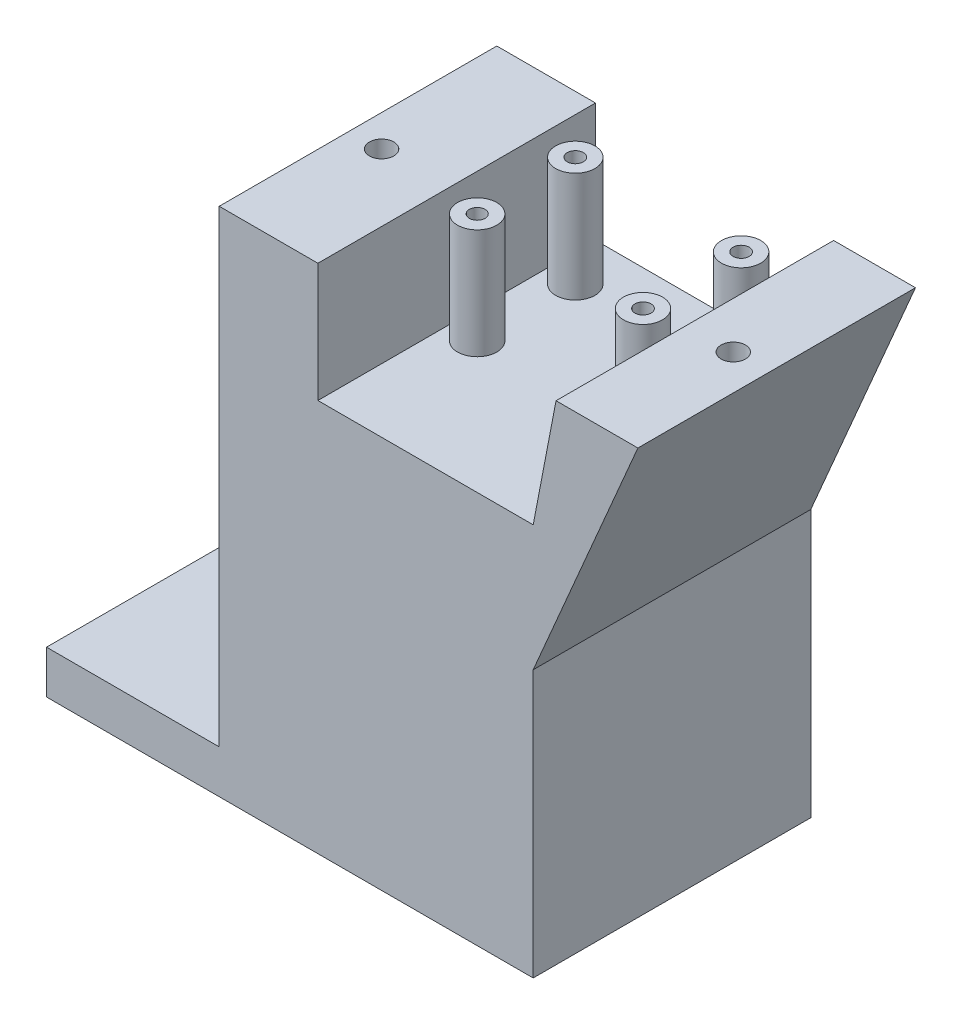
ISO-10303-21;
HEADER;
FILE_DESCRIPTION(('STEP AP214'),'2;1');
FILE_NAME('part.step','',(''),(''),'','','');
FILE_SCHEMA(('AUTOMOTIVE_DESIGN { 1 0 10303 214 1 1 1 1 }'));
ENDSEC;
DATA;
#1=APPLICATION_CONTEXT('core data for automotive mechanical design processes');
#2=APPLICATION_PROTOCOL_DEFINITION('international standard','automotive_design',2000,#1);
#3=PRODUCT_CONTEXT('',#1,'mechanical');
#4=PRODUCT('Part','Part','',(#3));
#5=PRODUCT_RELATED_PRODUCT_CATEGORY('part','',(#4));
#6=PRODUCT_DEFINITION_FORMATION('','',#4);
#7=PRODUCT_DEFINITION_CONTEXT('part definition',#1,'design');
#8=PRODUCT_DEFINITION('design','',#6,#7);
#9=PRODUCT_DEFINITION_SHAPE('','',#8);
#10=(LENGTH_UNIT() NAMED_UNIT(*) SI_UNIT(.MILLI.,.METRE.));
#11=(NAMED_UNIT(*) PLANE_ANGLE_UNIT() SI_UNIT($,.RADIAN.));
#12=(NAMED_UNIT(*) SI_UNIT($,.STERADIAN.) SOLID_ANGLE_UNIT());
#13=UNCERTAINTY_MEASURE_WITH_UNIT(LENGTH_MEASURE(1.E-05),#10,'distance_accuracy_value','');
#14=(GEOMETRIC_REPRESENTATION_CONTEXT(3) GLOBAL_UNCERTAINTY_ASSIGNED_CONTEXT((#13)) GLOBAL_UNIT_ASSIGNED_CONTEXT((#10,
#11,#12)) REPRESENTATION_CONTEXT('',''));
#15=CARTESIAN_POINT('',(0.,0.,0.));
#16=DIRECTION('',(0.,0.,1.));
#17=DIRECTION('',(1.,0.,0.));
#18=AXIS2_PLACEMENT_3D('',#15,#16,#17);
#19=CARTESIAN_POINT('',(0.,50.,0.));
#20=DIRECTION('',(0.,-1.,0.));
#21=DIRECTION('',(0.,0.,-1.));
#22=AXIS2_PLACEMENT_3D('',#19,#20,#21);
#23=PLANE('',#22);
#24=CARTESIAN_POINT('',(3.35567931406741,50.,3.88923337716912));
#25=DIRECTION('',(0.,-1.,0.));
#26=DIRECTION('',(0.,0.,-1.));
#27=AXIS2_PLACEMENT_3D('',#24,#25,#26);
#28=CIRCLE('',#27,2.5);
#29=CARTESIAN_POINT('',(3.35567931406741,50.,1.38923337716912));
#30=VERTEX_POINT('',#29);
#31=EDGE_CURVE('E349',#30,#30,#28,.F.);
#32=ORIENTED_EDGE('',*,*,#31,.F.);
#33=EDGE_LOOP('',(#32));
#34=FACE_BOUND('',#33,.T.);
#35=CARTESIAN_POINT('',(24.3556793140674,50.,3.76423337163295));
#36=DIRECTION('',(0.,-1.,0.));
#37=DIRECTION('',(0.,0.,-1.));
#38=AXIS2_PLACEMENT_3D('',#35,#36,#37);
#39=CIRCLE('',#38,2.5);
#40=CARTESIAN_POINT('',(24.3556793140674,50.,1.26423337163295));
#41=VERTEX_POINT('',#40);
#42=EDGE_CURVE('E353',#41,#41,#39,.F.);
#43=ORIENTED_EDGE('',*,*,#42,.F.);
#44=EDGE_LOOP('',(#43));
#45=FACE_BOUND('',#44,.T.);
#46=CARTESIAN_POINT('',(3.35567931406741,50.,-8.61076662283088));
#47=DIRECTION('',(0.,-1.,0.));
#48=DIRECTION('',(0.,0.,-1.));
#49=AXIS2_PLACEMENT_3D('',#46,#47,#48);
#50=CIRCLE('',#49,2.5);
#51=CARTESIAN_POINT('',(3.35567931406741,50.,-11.1107666228309));
#52=VERTEX_POINT('',#51);
#53=EDGE_CURVE('E55',#52,#52,#50,.F.);
#54=ORIENTED_EDGE('',*,*,#53,.F.);
#55=EDGE_LOOP('',(#54));
#56=FACE_BOUND('',#55,.T.);
#57=CARTESIAN_POINT('',(24.3553072869625,50.,-8.73576662283088));
#58=DIRECTION('',(0.,-1.,0.));
#59=DIRECTION('',(0.,0.,-1.));
#60=AXIS2_PLACEMENT_3D('',#57,#58,#59);
#61=CIRCLE('',#60,2.5);
#62=CARTESIAN_POINT('',(24.3553072869625,50.,-11.2357666228309));
#63=VERTEX_POINT('',#62);
#64=EDGE_CURVE('E11',#63,#63,#61,.F.);
#65=ORIENTED_EDGE('',*,*,#64,.F.);
#66=EDGE_LOOP('',(#65));
#67=FACE_BOUND('',#66,.T.);
#68=DIRECTION('',(0.,0.,-1.));
#69=VECTOR('',#68,1.);
#70=CARTESIAN_POINT('',(-0.197301823022314,50.,20.6271973839208));
#71=LINE('',#70,#69);
#72=CARTESIAN_POINT('',(-0.197301823022314,50.,20.6271973839208));
#73=VERTEX_POINT('',#72);
#74=CARTESIAN_POINT('',(-0.197301823022314,50.,-14.7357666228309));
#75=VERTEX_POINT('',#74);
#76=EDGE_CURVE('E67',#73,#75,#71,.T.);
#77=ORIENTED_EDGE('',*,*,#76,.F.);
#78=DIRECTION('',(1.,0.,0.));
#79=VECTOR('',#78,1.);
#80=CARTESIAN_POINT('',(-12.7693206859326,50.,20.6271973839208));
#81=LINE('',#80,#79);
#82=CARTESIAN_POINT('',(27.2306793140674,50.,20.6271973839208));
#83=VERTEX_POINT('',#82);
#84=EDGE_CURVE('E318',#73,#83,#81,.T.);
#85=ORIENTED_EDGE('',*,*,#84,.T.);
#86=DIRECTION('',(0.,0.,-1.));
#87=VECTOR('',#86,1.);
#88=CARTESIAN_POINT('',(27.2306793140674,50.,20.6271973839208));
#89=LINE('',#88,#87);
#90=CARTESIAN_POINT('',(27.2306793140674,50.,-14.7357666228309));
#91=VERTEX_POINT('',#90);
#92=EDGE_CURVE('E321',#83,#91,#89,.T.);
#93=ORIENTED_EDGE('',*,*,#92,.T.);
#94=DIRECTION('',(-1.,0.,0.));
#95=VECTOR('',#94,1.);
#96=CARTESIAN_POINT('',(-12.7693206859326,50.,-14.7357666228309));
#97=LINE('',#96,#95);
#98=EDGE_CURVE('E62',#91,#75,#97,.T.);
#99=ORIENTED_EDGE('',*,*,#98,.T.);
#100=EDGE_LOOP('',(#77,#85,#93,#99));
#101=FACE_BOUND('',#100,.T.);
#102=ADVANCED_FACE('F45',(#34,#45,#56,#67,#101),#23,.F.);
#103=CARTESIAN_POINT('',(-12.7693206859326,50.,20.6271973839208));
#104=DIRECTION('',(1.,0.,0.));
#105=DIRECTION('',(0.,0.,-1.));
#106=AXIS2_PLACEMENT_3D('',#103,#104,#105);
#107=PLANE('',#106);
#108=DIRECTION('',(0.,0.,-1.));
#109=VECTOR('',#108,1.);
#110=CARTESIAN_POINT('',(-12.7693206859326,5.5,-14.7357666228309));
#111=LINE('',#110,#109);
#112=CARTESIAN_POINT('',(-12.7693206859326,5.5,20.6271973839208));
#113=VERTEX_POINT('',#112);
#114=CARTESIAN_POINT('',(-12.7693206859326,5.5,-14.7357666228309));
#115=VERTEX_POINT('',#114);
#116=EDGE_CURVE('E291',#113,#115,#111,.T.);
#117=ORIENTED_EDGE('',*,*,#116,.F.);
#118=DIRECTION('',(0.,-1.,0.));
#119=VECTOR('',#118,1.);
#120=CARTESIAN_POINT('',(-12.7693206859326,50.,20.6271973839208));
#121=LINE('',#120,#119);
#122=CARTESIAN_POINT('',(-12.7693206859326,65.1441076494224,20.6271973839208));
#123=VERTEX_POINT('',#122);
#124=EDGE_CURVE('E345',#123,#113,#121,.T.);
#125=ORIENTED_EDGE('',*,*,#124,.F.);
#126=DIRECTION('',(0.,0.,1.));
#127=VECTOR('',#126,1.);
#128=CARTESIAN_POINT('',(-12.7693206859326,65.1441076494224,20.6271973839208));
#129=LINE('',#128,#127);
#130=CARTESIAN_POINT('',(-12.7693206859326,65.1441076494224,-14.7357666228309));
#131=VERTEX_POINT('',#130);
#132=EDGE_CURVE('E194',#131,#123,#129,.T.);
#133=ORIENTED_EDGE('',*,*,#132,.F.);
#134=DIRECTION('',(0.,-1.,0.));
#135=VECTOR('',#134,1.);
#136=CARTESIAN_POINT('',(-12.7693206859326,50.,-14.7357666228309));
#137=LINE('',#136,#135);
#138=EDGE_CURVE('E327',#131,#115,#137,.T.);
#139=ORIENTED_EDGE('',*,*,#138,.T.);
#140=EDGE_LOOP('',(#117,#125,#133,#139));
#141=FACE_BOUND('',#140,.T.);
#142=ADVANCED_FACE('F47',(#141),#107,.F.);
#143=CARTESIAN_POINT('',(-12.7693206859326,50.,20.6271973839208));
#144=DIRECTION('',(0.,0.,-1.));
#145=DIRECTION('',(-1.,0.,0.));
#146=AXIS2_PLACEMENT_3D('',#143,#144,#145);
#147=PLANE('',#146);
#148=DIRECTION('',(1.,0.,0.));
#149=VECTOR('',#148,1.);
#150=CARTESIAN_POINT('',(-12.7693206859326,0.,20.6271973839208));
#151=LINE('',#150,#149);
#152=CARTESIAN_POINT('',(-34.7693206859326,0.,20.6271973839208));
#153=VERTEX_POINT('',#152);
#154=CARTESIAN_POINT('',(27.2306793140674,0.,20.6271973839208));
#155=VERTEX_POINT('',#154);
#156=EDGE_CURVE('E317',#153,#155,#151,.T.);
#157=ORIENTED_EDGE('',*,*,#156,.T.);
#158=DIRECTION('',(0.,-1.,0.));
#159=VECTOR('',#158,1.);
#160=CARTESIAN_POINT('',(27.2306793140674,50.,20.6271973839208));
#161=LINE('',#160,#159);
#162=CARTESIAN_POINT('',(27.2306793140674,34.0105181508013,20.6271973839208));
#163=VERTEX_POINT('',#162);
#164=EDGE_CURVE('E342',#163,#155,#161,.T.);
#165=ORIENTED_EDGE('',*,*,#164,.F.);
#166=DIRECTION('',(0.393793297715324,0.919199020166194,0.));
#167=VECTOR('',#166,1.);
#168=CARTESIAN_POINT('',(27.2306793140674,34.0105181508013,20.6271973839208));
#169=LINE('',#168,#167);
#170=CARTESIAN_POINT('',(40.5685948355184,65.1441076494224,20.6271973839208));
#171=VERTEX_POINT('',#170);
#172=EDGE_CURVE('E189',#163,#171,#169,.T.);
#173=ORIENTED_EDGE('',*,*,#172,.T.);
#174=DIRECTION('',(-1.,0.,0.));
#175=VECTOR('',#174,1.);
#176=CARTESIAN_POINT('',(40.5685948355184,65.1441076494224,20.6271973839208));
#177=LINE('',#176,#175);
#178=CARTESIAN_POINT('',(30.1398898080527,65.1441076494224,20.6271973839208));
#179=VERTEX_POINT('',#178);
#180=EDGE_CURVE('E223',#171,#179,#177,.T.);
#181=ORIENTED_EDGE('',*,*,#180,.T.);
#182=DIRECTION('',(-0.188652415298672,-0.98204392274581,0.));
#183=VECTOR('',#182,1.);
#184=CARTESIAN_POINT('',(30.1398898080527,65.1441076494224,20.6271973839208));
#185=LINE('',#184,#183);
#186=EDGE_CURVE('E212',#179,#83,#185,.T.);
#187=ORIENTED_EDGE('',*,*,#186,.T.);
#188=ORIENTED_EDGE('',*,*,#84,.F.);
#189=DIRECTION('',(0.,-1.,0.));
#190=VECTOR('',#189,1.);
#191=CARTESIAN_POINT('',(-0.197301823022314,102.675359715297,20.6271973839208));
#192=LINE('',#191,#190);
#193=CARTESIAN_POINT('',(-0.197301823022314,65.1441076494224,20.6271973839208));
#194=VERTEX_POINT('',#193);
#195=EDGE_CURVE('E181',#194,#73,#192,.T.);
#196=ORIENTED_EDGE('',*,*,#195,.F.);
#197=DIRECTION('',(1.,0.,0.));
#198=VECTOR('',#197,1.);
#199=CARTESIAN_POINT('',(-12.7693206859326,65.1441076494224,20.6271973839208));
#200=LINE('',#199,#198);
#201=EDGE_CURVE('E190',#123,#194,#200,.T.);
#202=ORIENTED_EDGE('',*,*,#201,.F.);
#203=ORIENTED_EDGE('',*,*,#124,.T.);
#204=DIRECTION('',(1.,0.,0.));
#205=VECTOR('',#204,1.);
#206=CARTESIAN_POINT('',(-34.7693206859326,5.5,20.6271973839208));
#207=LINE('',#206,#205);
#208=CARTESIAN_POINT('',(-34.7693206859326,5.5,20.6271973839208));
#209=VERTEX_POINT('',#208);
#210=EDGE_CURVE('E313',#209,#113,#207,.T.);
#211=ORIENTED_EDGE('',*,*,#210,.F.);
#212=DIRECTION('',(0.,1.,0.));
#213=VECTOR('',#212,1.);
#214=CARTESIAN_POINT('',(-34.7693206859326,5.5,20.6271973839208));
#215=LINE('',#214,#213);
#216=EDGE_CURVE('E300',#153,#209,#215,.T.);
#217=ORIENTED_EDGE('',*,*,#216,.F.);
#218=EDGE_LOOP('',(#157,#165,#173,#181,#187,#188,#196,#202,#203,#211,#217));
#219=FACE_BOUND('',#218,.T.);
#220=ADVANCED_FACE('F445',(#219),#147,.F.);
#221=CARTESIAN_POINT('',(27.2306793140674,50.,20.6271973839208));
#222=DIRECTION('',(-1.,0.,0.));
#223=DIRECTION('',(0.,0.,1.));
#224=AXIS2_PLACEMENT_3D('',#221,#222,#223);
#225=PLANE('',#224);
#226=DIRECTION('',(0.,-1.,0.));
#227=VECTOR('',#226,1.);
#228=CARTESIAN_POINT('',(27.2306793140674,50.,-14.7357666228309));
#229=LINE('',#228,#227);
#230=CARTESIAN_POINT('',(27.2306793140674,34.0105181508013,-14.7357666228309));
#231=VERTEX_POINT('',#230);
#232=CARTESIAN_POINT('',(27.2306793140674,0.,-14.7357666228309));
#233=VERTEX_POINT('',#232);
#234=EDGE_CURVE('E339',#231,#233,#229,.T.);
#235=ORIENTED_EDGE('',*,*,#234,.F.);
#236=DIRECTION('',(0.,0.,1.));
#237=VECTOR('',#236,1.);
#238=CARTESIAN_POINT('',(27.2306793140674,34.0105181508013,-14.7357666228309));
#239=LINE('',#238,#237);
#240=EDGE_CURVE('E219',#231,#163,#239,.T.);
#241=ORIENTED_EDGE('',*,*,#240,.T.);
#242=ORIENTED_EDGE('',*,*,#164,.T.);
#243=DIRECTION('',(0.,0.,-1.));
#244=VECTOR('',#243,1.);
#245=CARTESIAN_POINT('',(27.2306793140674,0.,20.6271973839208));
#246=LINE('',#245,#244);
#247=EDGE_CURVE('E331',#155,#233,#246,.T.);
#248=ORIENTED_EDGE('',*,*,#247,.T.);
#249=EDGE_LOOP('',(#235,#241,#242,#248));
#250=FACE_BOUND('',#249,.T.);
#251=ADVANCED_FACE('F442',(#250),#225,.F.);
#252=CARTESIAN_POINT('',(-12.7693206859326,50.,-14.7357666228309));
#253=DIRECTION('',(0.,0.,1.));
#254=DIRECTION('',(1.,0.,0.));
#255=AXIS2_PLACEMENT_3D('',#252,#253,#254);
#256=PLANE('',#255);
#257=DIRECTION('',(-1.,0.,0.));
#258=VECTOR('',#257,1.);
#259=CARTESIAN_POINT('',(-12.7693206859326,0.,-14.7357666228309));
#260=LINE('',#259,#258);
#261=CARTESIAN_POINT('',(-34.7693206859326,0.,-14.7357666228309));
#262=VERTEX_POINT('',#261);
#263=EDGE_CURVE('E322',#233,#262,#260,.T.);
#264=ORIENTED_EDGE('',*,*,#263,.T.);
#265=DIRECTION('',(0.,-1.,0.));
#266=VECTOR('',#265,1.);
#267=CARTESIAN_POINT('',(-34.7693206859326,5.5,-14.7357666228309));
#268=LINE('',#267,#266);
#269=CARTESIAN_POINT('',(-34.7693206859326,5.5,-14.7357666228309));
#270=VERTEX_POINT('',#269);
#271=EDGE_CURVE('E292',#270,#262,#268,.T.);
#272=ORIENTED_EDGE('',*,*,#271,.F.);
#273=DIRECTION('',(1.,0.,0.));
#274=VECTOR('',#273,1.);
#275=CARTESIAN_POINT('',(-34.7693206859326,5.5,-14.7357666228309));
#276=LINE('',#275,#274);
#277=EDGE_CURVE('E306',#270,#115,#276,.T.);
#278=ORIENTED_EDGE('',*,*,#277,.T.);
#279=ORIENTED_EDGE('',*,*,#138,.F.);
#280=DIRECTION('',(-1.,0.,0.));
#281=VECTOR('',#280,1.);
#282=CARTESIAN_POINT('',(-12.7693206859326,65.1441076494224,-14.7357666228309));
#283=LINE('',#282,#281);
#284=CARTESIAN_POINT('',(-0.197301823022314,65.1441076494224,-14.7357666228309));
#285=VERTEX_POINT('',#284);
#286=EDGE_CURVE('E198',#285,#131,#283,.T.);
#287=ORIENTED_EDGE('',*,*,#286,.F.);
#288=DIRECTION('',(0.,-1.,0.));
#289=VECTOR('',#288,1.);
#290=CARTESIAN_POINT('',(-0.197301823022314,102.675359715297,-14.7357666228309));
#291=LINE('',#290,#289);
#292=EDGE_CURVE('E184',#285,#75,#291,.T.);
#293=ORIENTED_EDGE('',*,*,#292,.T.);
#294=ORIENTED_EDGE('',*,*,#98,.F.);
#295=DIRECTION('',(-0.188652415298672,-0.98204392274581,0.));
#296=VECTOR('',#295,1.);
#297=CARTESIAN_POINT('',(30.1398898080527,65.1441076494224,-14.7357666228309));
#298=LINE('',#297,#296);
#299=CARTESIAN_POINT('',(30.1398898080527,65.1441076494224,-14.7357666228309));
#300=VERTEX_POINT('',#299);
#301=EDGE_CURVE('E216',#300,#91,#298,.T.);
#302=ORIENTED_EDGE('',*,*,#301,.F.);
#303=DIRECTION('',(-1.,0.,0.));
#304=VECTOR('',#303,1.);
#305=CARTESIAN_POINT('',(40.5685948355184,65.1441076494224,-14.7357666228309));
#306=LINE('',#305,#304);
#307=CARTESIAN_POINT('',(40.5685948355184,65.1441076494224,-14.7357666228309));
#308=VERTEX_POINT('',#307);
#309=EDGE_CURVE('E211',#308,#300,#306,.T.);
#310=ORIENTED_EDGE('',*,*,#309,.F.);
#311=DIRECTION('',(0.393793297715324,0.919199020166194,0.));
#312=VECTOR('',#311,1.);
#313=CARTESIAN_POINT('',(27.2306793140674,34.0105181508013,-14.7357666228309));
#314=LINE('',#313,#312);
#315=EDGE_CURVE('E207',#231,#308,#314,.T.);
#316=ORIENTED_EDGE('',*,*,#315,.F.);
#317=ORIENTED_EDGE('',*,*,#234,.T.);
#318=EDGE_LOOP('',(#264,#272,#278,#279,#287,#293,#294,#302,#310,#316,#317));
#319=FACE_BOUND('',#318,.T.);
#320=ADVANCED_FACE('F438',(#319),#256,.F.);
#321=CARTESIAN_POINT('',(0.,0.,0.));
#322=DIRECTION('',(0.,-1.,0.));
#323=DIRECTION('',(0.,0.,-1.));
#324=AXIS2_PLACEMENT_3D('',#321,#322,#323);
#325=PLANE('',#324);
#326=CARTESIAN_POINT('',(-8.47371971543409,0.,2.94571538054497));
#327=DIRECTION('',(0.,-1.,0.));
#328=DIRECTION('',(0.,0.,-1.));
#329=AXIS2_PLACEMENT_3D('',#326,#327,#328);
#330=CIRCLE('',#329,1.55);
#331=CARTESIAN_POINT('',(-8.47371971543409,0.,1.39571538054497));
#332=VERTEX_POINT('',#331);
#333=EDGE_CURVE('E152',#332,#332,#330,.T.);
#334=ORIENTED_EDGE('',*,*,#333,.F.);
#335=EDGE_LOOP('',(#334));
#336=FACE_BOUND('',#335,.T.);
#337=CARTESIAN_POINT('',(20.2306793140674,0.,2.94571538054498));
#338=DIRECTION('',(0.,-1.,0.));
#339=DIRECTION('',(0.,0.,-1.));
#340=AXIS2_PLACEMENT_3D('',#337,#338,#339);
#341=CIRCLE('',#340,1.55);
#342=CARTESIAN_POINT('',(20.2306793140674,0.,1.39571538054498));
#343=VERTEX_POINT('',#342);
#344=EDGE_CURVE('E151',#343,#343,#341,.T.);
#345=ORIENTED_EDGE('',*,*,#344,.F.);
#346=EDGE_LOOP('',(#345));
#347=FACE_BOUND('',#346,.T.);
#348=CARTESIAN_POINT('',(-24.7693206859326,0.,2.94571538054497));
#349=DIRECTION('',(0.,-1.,0.));
#350=DIRECTION('',(0.,0.,-1.));
#351=AXIS2_PLACEMENT_3D('',#348,#349,#350);
#352=CIRCLE('',#351,3.99999999999999);
#353=CARTESIAN_POINT('',(-24.7693206859326,0.,-1.05428461945502));
#354=VERTEX_POINT('',#353);
#355=EDGE_CURVE('E233',#354,#354,#352,.T.);
#356=ORIENTED_EDGE('',*,*,#355,.F.);
#357=EDGE_LOOP('',(#356));
#358=FACE_BOUND('',#357,.T.);
#359=ORIENTED_EDGE('',*,*,#156,.F.);
#360=DIRECTION('',(0.,0.,1.));
#361=VECTOR('',#360,1.);
#362=CARTESIAN_POINT('',(-34.7693206859326,0.,-14.7357666228309));
#363=LINE('',#362,#361);
#364=EDGE_CURVE('E296',#262,#153,#363,.T.);
#365=ORIENTED_EDGE('',*,*,#364,.F.);
#366=ORIENTED_EDGE('',*,*,#263,.F.);
#367=ORIENTED_EDGE('',*,*,#247,.F.);
#368=EDGE_LOOP('',(#359,#365,#366,#367));
#369=FACE_BOUND('',#368,.T.);
#370=ADVANCED_FACE('F433',(#336,#347,#358,#369),#325,.T.);
#371=CARTESIAN_POINT('',(-34.7693206859326,5.5,-14.7357666228309));
#372=DIRECTION('',(0.,-1.,0.));
#373=DIRECTION('',(0.,0.,-1.));
#374=AXIS2_PLACEMENT_3D('',#371,#372,#373);
#375=PLANE('',#374);
#376=CARTESIAN_POINT('',(-24.7693206859326,5.5,2.94571538054497));
#377=DIRECTION('',(0.,-1.,0.));
#378=DIRECTION('',(0.,0.,-1.));
#379=AXIS2_PLACEMENT_3D('',#376,#377,#378);
#380=CIRCLE('',#379,3.99999999999999);
#381=CARTESIAN_POINT('',(-24.7693206859326,5.5,-1.05428461945501));
#382=VERTEX_POINT('',#381);
#383=EDGE_CURVE('E49',#382,#382,#380,.T.);
#384=ORIENTED_EDGE('',*,*,#383,.T.);
#385=EDGE_LOOP('',(#384));
#386=FACE_BOUND('',#385,.T.);
#387=ORIENTED_EDGE('',*,*,#116,.T.);
#388=ORIENTED_EDGE('',*,*,#277,.F.);
#389=DIRECTION('',(0.,0.,-1.));
#390=VECTOR('',#389,1.);
#391=CARTESIAN_POINT('',(-34.7693206859326,5.5,-14.7357666228309));
#392=LINE('',#391,#390);
#393=EDGE_CURVE('E303',#209,#270,#392,.T.);
#394=ORIENTED_EDGE('',*,*,#393,.F.);
#395=ORIENTED_EDGE('',*,*,#210,.T.);
#396=EDGE_LOOP('',(#387,#388,#394,#395));
#397=FACE_BOUND('',#396,.T.);
#398=ADVANCED_FACE('F430',(#386,#397),#375,.F.);
#399=CARTESIAN_POINT('',(-34.7693206859326,0.,0.));
#400=DIRECTION('',(-1.,0.,0.));
#401=DIRECTION('',(0.,0.,1.));
#402=AXIS2_PLACEMENT_3D('',#399,#400,#401);
#403=PLANE('',#402);
#404=ORIENTED_EDGE('',*,*,#271,.T.);
#405=ORIENTED_EDGE('',*,*,#364,.T.);
#406=ORIENTED_EDGE('',*,*,#216,.T.);
#407=ORIENTED_EDGE('',*,*,#393,.T.);
#408=EDGE_LOOP('',(#404,#405,#406,#407));
#409=FACE_BOUND('',#408,.T.);
#410=ADVANCED_FACE('F423',(#409),#403,.T.);
#411=CARTESIAN_POINT('',(3.35567931406741,64.,3.88923337716912));
#412=DIRECTION('',(0.,1.,0.));
#413=DIRECTION('',(0.,0.,1.));
#414=AXIS2_PLACEMENT_3D('',#411,#412,#413);
#415=PLANE('',#414);
#416=CARTESIAN_POINT('',(3.35567931406741,64.,3.88923337716912));
#417=DIRECTION('',(0.,1.,0.));
#418=DIRECTION('',(0.,0.,1.));
#419=AXIS2_PLACEMENT_3D('',#416,#417,#418);
#420=CIRCLE('',#419,2.5);
#421=CARTESIAN_POINT('',(3.35567931406741,64.,6.38923337716912));
#422=VERTEX_POINT('',#421);
#423=EDGE_CURVE('E284',#422,#422,#420,.T.);
#424=ORIENTED_EDGE('',*,*,#423,.T.);
#425=EDGE_LOOP('',(#424));
#426=FACE_BOUND('',#425,.T.);
#427=CARTESIAN_POINT('',(3.35567931406741,64.,3.88923337716912));
#428=DIRECTION('',(0.,1.,0.));
#429=DIRECTION('',(0.,0.,1.));
#430=AXIS2_PLACEMENT_3D('',#427,#428,#429);
#431=CIRCLE('',#430,0.999999999999998);
#432=CARTESIAN_POINT('',(3.35567931406741,64.,4.88923337716912));
#433=VERTEX_POINT('',#432);
#434=EDGE_CURVE('E280',#433,#433,#431,.T.);
#435=ORIENTED_EDGE('',*,*,#434,.F.);
#436=EDGE_LOOP('',(#435));
#437=FACE_BOUND('',#436,.T.);
#438=ADVANCED_FACE('F420',(#426,#437),#415,.T.);
#439=CARTESIAN_POINT('',(3.35567931406741,64.,3.88923337716912));
#440=DIRECTION('',(0.,-1.,0.));
#441=DIRECTION('',(0.,0.,-1.));
#442=AXIS2_PLACEMENT_3D('',#439,#440,#441);
#443=CYLINDRICAL_SURFACE('',#442,2.5);
#444=ORIENTED_EDGE('',*,*,#423,.F.);
#445=EDGE_LOOP('',(#444));
#446=FACE_BOUND('',#445,.T.);
#447=ORIENTED_EDGE('',*,*,#31,.T.);
#448=EDGE_LOOP('',(#447));
#449=FACE_BOUND('',#448,.T.);
#450=ADVANCED_FACE('F418',(#446,#449),#443,.T.);
#451=CARTESIAN_POINT('',(3.35567931406741,64.,3.88923337716912));
#452=DIRECTION('',(0.,-1.,0.));
#453=DIRECTION('',(0.,0.,-1.));
#454=AXIS2_PLACEMENT_3D('',#451,#452,#453);
#455=CYLINDRICAL_SURFACE('',#454,0.999999999999998);
#456=ORIENTED_EDGE('',*,*,#434,.T.);
#457=EDGE_LOOP('',(#456));
#458=FACE_BOUND('',#457,.T.);
#459=CARTESIAN_POINT('',(3.35567931406741,50.,3.88923337716912));
#460=DIRECTION('',(0.,1.,0.));
#461=DIRECTION('',(0.,0.,1.));
#462=AXIS2_PLACEMENT_3D('',#459,#460,#461);
#463=CIRCLE('',#462,0.999999999999998);
#464=CARTESIAN_POINT('',(3.35567931406741,50.,4.88923337716912));
#465=VERTEX_POINT('',#464);
#466=EDGE_CURVE('E276',#465,#465,#463,.T.);
#467=ORIENTED_EDGE('',*,*,#466,.F.);
#468=EDGE_LOOP('',(#467));
#469=FACE_BOUND('',#468,.T.);
#470=ADVANCED_FACE('F415',(#458,#469),#455,.F.);
#471=ORIENTED_EDGE('',*,*,#466,.T.);
#472=EDGE_LOOP('',(#471));
#473=FACE_BOUND('',#472,.T.);
#474=ADVANCED_FACE('F368',(#473),#23,.F.);
#475=CARTESIAN_POINT('',(24.3556793140674,64.,3.76423337163295));
#476=DIRECTION('',(0.,1.,0.));
#477=DIRECTION('',(0.,0.,1.));
#478=AXIS2_PLACEMENT_3D('',#475,#476,#477);
#479=PLANE('',#478);
#480=CARTESIAN_POINT('',(24.3556793140674,64.,3.76423337163295));
#481=DIRECTION('',(0.,1.,0.));
#482=DIRECTION('',(0.,0.,1.));
#483=AXIS2_PLACEMENT_3D('',#480,#481,#482);
#484=CIRCLE('',#483,2.5);
#485=CARTESIAN_POINT('',(24.3556793140674,64.,6.26423337163295));
#486=VERTEX_POINT('',#485);
#487=EDGE_CURVE('E264',#486,#486,#484,.T.);
#488=ORIENTED_EDGE('',*,*,#487,.T.);
#489=EDGE_LOOP('',(#488));
#490=FACE_BOUND('',#489,.T.);
#491=CARTESIAN_POINT('',(24.3556793140674,64.,3.76423337163295));
#492=DIRECTION('',(0.,1.,0.));
#493=DIRECTION('',(0.,0.,1.));
#494=AXIS2_PLACEMENT_3D('',#491,#492,#493);
#495=CIRCLE('',#494,1.025);
#496=CARTESIAN_POINT('',(24.3556793140674,64.,4.78923337163296));
#497=VERTEX_POINT('',#496);
#498=EDGE_CURVE('E271',#497,#497,#495,.T.);
#499=ORIENTED_EDGE('',*,*,#498,.F.);
#500=EDGE_LOOP('',(#499));
#501=FACE_BOUND('',#500,.T.);
#502=ADVANCED_FACE('F407',(#490,#501),#479,.T.);
#503=CARTESIAN_POINT('',(24.3556793140674,64.,3.76423337163295));
#504=DIRECTION('',(0.,-1.,0.));
#505=DIRECTION('',(0.,0.,-1.));
#506=AXIS2_PLACEMENT_3D('',#503,#504,#505);
#507=CYLINDRICAL_SURFACE('',#506,2.5);
#508=ORIENTED_EDGE('',*,*,#487,.F.);
#509=EDGE_LOOP('',(#508));
#510=FACE_BOUND('',#509,.T.);
#511=ORIENTED_EDGE('',*,*,#42,.T.);
#512=EDGE_LOOP('',(#511));
#513=FACE_BOUND('',#512,.T.);
#514=ADVANCED_FACE('F403',(#510,#513),#507,.T.);
#515=CARTESIAN_POINT('',(24.3556793140674,64.,3.76423337163295));
#516=DIRECTION('',(0.,-1.,0.));
#517=DIRECTION('',(0.,0.,-1.));
#518=AXIS2_PLACEMENT_3D('',#515,#516,#517);
#519=CYLINDRICAL_SURFACE('',#518,1.025);
#520=ORIENTED_EDGE('',*,*,#498,.T.);
#521=EDGE_LOOP('',(#520));
#522=FACE_BOUND('',#521,.T.);
#523=CARTESIAN_POINT('',(24.3556793140674,50.,3.76423337163295));
#524=DIRECTION('',(0.,1.,0.));
#525=DIRECTION('',(0.,0.,1.));
#526=AXIS2_PLACEMENT_3D('',#523,#524,#525);
#527=CIRCLE('',#526,1.025);
#528=CARTESIAN_POINT('',(24.3556793140674,50.,4.78923337163296));
#529=VERTEX_POINT('',#528);
#530=EDGE_CURVE('E272',#529,#529,#527,.T.);
#531=ORIENTED_EDGE('',*,*,#530,.F.);
#532=EDGE_LOOP('',(#531));
#533=FACE_BOUND('',#532,.T.);
#534=ADVANCED_FACE('F406',(#522,#533),#519,.F.);
#535=ORIENTED_EDGE('',*,*,#530,.T.);
#536=EDGE_LOOP('',(#535));
#537=FACE_BOUND('',#536,.T.);
#538=ADVANCED_FACE('F398',(#537),#23,.F.);
#539=CARTESIAN_POINT('',(3.35567931406741,64.,-8.61076662283088));
#540=DIRECTION('',(0.,1.,0.));
#541=DIRECTION('',(0.,0.,1.));
#542=AXIS2_PLACEMENT_3D('',#539,#540,#541);
#543=PLANE('',#542);
#544=CARTESIAN_POINT('',(3.35567931406741,64.,-8.61076662283088));
#545=DIRECTION('',(0.,1.,0.));
#546=DIRECTION('',(0.,0.,1.));
#547=AXIS2_PLACEMENT_3D('',#544,#545,#546);
#548=CIRCLE('',#547,2.5);
#549=CARTESIAN_POINT('',(3.35567931406741,64.,-6.11076662283088));
#550=VERTEX_POINT('',#549);
#551=EDGE_CURVE('E252',#550,#550,#548,.T.);
#552=ORIENTED_EDGE('',*,*,#551,.T.);
#553=EDGE_LOOP('',(#552));
#554=FACE_BOUND('',#553,.T.);
#555=CARTESIAN_POINT('',(3.35567931406741,64.,-8.61076662283088));
#556=DIRECTION('',(0.,1.,0.));
#557=DIRECTION('',(0.,0.,1.));
#558=AXIS2_PLACEMENT_3D('',#555,#556,#557);
#559=CIRCLE('',#558,1.02499999999999);
#560=CARTESIAN_POINT('',(3.35567931406741,64.,-7.58576662283089));
#561=VERTEX_POINT('',#560);
#562=EDGE_CURVE('E259',#561,#561,#559,.T.);
#563=ORIENTED_EDGE('',*,*,#562,.F.);
#564=EDGE_LOOP('',(#563));
#565=FACE_BOUND('',#564,.T.);
#566=ADVANCED_FACE('F394',(#554,#565),#543,.T.);
#567=CARTESIAN_POINT('',(3.35567931406741,64.,-8.61076662283088));
#568=DIRECTION('',(0.,-1.,0.));
#569=DIRECTION('',(0.,0.,-1.));
#570=AXIS2_PLACEMENT_3D('',#567,#568,#569);
#571=CYLINDRICAL_SURFACE('',#570,2.5);
#572=ORIENTED_EDGE('',*,*,#551,.F.);
#573=EDGE_LOOP('',(#572));
#574=FACE_BOUND('',#573,.T.);
#575=ORIENTED_EDGE('',*,*,#53,.T.);
#576=EDGE_LOOP('',(#575));
#577=FACE_BOUND('',#576,.T.);
#578=ADVANCED_FACE('F361',(#574,#577),#571,.T.);
#579=CARTESIAN_POINT('',(3.35567931406741,64.,-8.61076662283088));
#580=DIRECTION('',(0.,-1.,0.));
#581=DIRECTION('',(0.,0.,-1.));
#582=AXIS2_PLACEMENT_3D('',#579,#580,#581);
#583=CYLINDRICAL_SURFACE('',#582,1.02499999999999);
#584=ORIENTED_EDGE('',*,*,#562,.T.);
#585=EDGE_LOOP('',(#584));
#586=FACE_BOUND('',#585,.T.);
#587=CARTESIAN_POINT('',(3.35567931406741,50.,-8.61076662283088));
#588=DIRECTION('',(0.,1.,0.));
#589=DIRECTION('',(0.,0.,1.));
#590=AXIS2_PLACEMENT_3D('',#587,#588,#589);
#591=CIRCLE('',#590,1.02499999999999);
#592=CARTESIAN_POINT('',(3.35567931406741,50.,-7.58576662283089));
#593=VERTEX_POINT('',#592);
#594=EDGE_CURVE('E260',#593,#593,#591,.T.);
#595=ORIENTED_EDGE('',*,*,#594,.F.);
#596=EDGE_LOOP('',(#595));
#597=FACE_BOUND('',#596,.T.);
#598=ADVANCED_FACE('F393',(#586,#597),#583,.F.);
#599=ORIENTED_EDGE('',*,*,#594,.T.);
#600=EDGE_LOOP('',(#599));
#601=FACE_BOUND('',#600,.T.);
#602=ADVANCED_FACE('F383',(#601),#23,.F.);
#603=CARTESIAN_POINT('',(24.3553072869625,64.,-8.73576662283088));
#604=DIRECTION('',(0.,1.,0.));
#605=DIRECTION('',(0.,0.,1.));
#606=AXIS2_PLACEMENT_3D('',#603,#604,#605);
#607=PLANE('',#606);
#608=CARTESIAN_POINT('',(24.3553072869625,64.,-8.73576662283088));
#609=DIRECTION('',(0.,1.,0.));
#610=DIRECTION('',(0.,0.,1.));
#611=AXIS2_PLACEMENT_3D('',#608,#609,#610);
#612=CIRCLE('',#611,2.5);
#613=CARTESIAN_POINT('',(24.3553072869625,64.,-6.23576662283088));
#614=VERTEX_POINT('',#613);
#615=EDGE_CURVE('E243',#614,#614,#612,.T.);
#616=ORIENTED_EDGE('',*,*,#615,.T.);
#617=EDGE_LOOP('',(#616));
#618=FACE_BOUND('',#617,.T.);
#619=CARTESIAN_POINT('',(24.3553072869625,64.,-8.73576662283088));
#620=DIRECTION('',(0.,1.,0.));
#621=DIRECTION('',(0.,0.,1.));
#622=AXIS2_PLACEMENT_3D('',#619,#620,#621);
#623=CIRCLE('',#622,1.025);
#624=CARTESIAN_POINT('',(24.3553072869625,64.,-7.71076662283088));
#625=VERTEX_POINT('',#624);
#626=EDGE_CURVE('E247',#625,#625,#623,.T.);
#627=ORIENTED_EDGE('',*,*,#626,.F.);
#628=EDGE_LOOP('',(#627));
#629=FACE_BOUND('',#628,.T.);
#630=ADVANCED_FACE('F374',(#618,#629),#607,.T.);
#631=CARTESIAN_POINT('',(24.3553072869625,64.,-8.73576662283088));
#632=DIRECTION('',(0.,-1.,0.));
#633=DIRECTION('',(0.,0.,-1.));
#634=AXIS2_PLACEMENT_3D('',#631,#632,#633);
#635=CYLINDRICAL_SURFACE('',#634,2.5);
#636=ORIENTED_EDGE('',*,*,#615,.F.);
#637=EDGE_LOOP('',(#636));
#638=FACE_BOUND('',#637,.T.);
#639=ORIENTED_EDGE('',*,*,#64,.T.);
#640=EDGE_LOOP('',(#639));
#641=FACE_BOUND('',#640,.T.);
#642=ADVANCED_FACE('F371',(#638,#641),#635,.T.);
#643=CARTESIAN_POINT('',(24.3553072869625,64.,-8.73576662283088));
#644=DIRECTION('',(0.,-1.,0.));
#645=DIRECTION('',(0.,0.,-1.));
#646=AXIS2_PLACEMENT_3D('',#643,#644,#645);
#647=CYLINDRICAL_SURFACE('',#646,1.025);
#648=ORIENTED_EDGE('',*,*,#626,.T.);
#649=EDGE_LOOP('',(#648));
#650=FACE_BOUND('',#649,.T.);
#651=CARTESIAN_POINT('',(24.3553072869625,50.,-8.73576662283088));
#652=DIRECTION('',(0.,1.,0.));
#653=DIRECTION('',(0.,0.,1.));
#654=AXIS2_PLACEMENT_3D('',#651,#652,#653);
#655=CIRCLE('',#654,1.025);
#656=CARTESIAN_POINT('',(24.3553072869625,50.,-7.71076662283088));
#657=VERTEX_POINT('',#656);
#658=EDGE_CURVE('E248',#657,#657,#655,.T.);
#659=ORIENTED_EDGE('',*,*,#658,.F.);
#660=EDGE_LOOP('',(#659));
#661=FACE_BOUND('',#660,.T.);
#662=ADVANCED_FACE('F373',(#650,#661),#647,.F.);
#663=ORIENTED_EDGE('',*,*,#658,.T.);
#664=EDGE_LOOP('',(#663));
#665=FACE_BOUND('',#664,.T.);
#666=ADVANCED_FACE('F367',(#665),#23,.F.);
#667=CARTESIAN_POINT('',(-24.7693206859326,0.,2.94571538054497));
#668=DIRECTION('',(0.,-1.,0.));
#669=DIRECTION('',(0.,0.,-1.));
#670=AXIS2_PLACEMENT_3D('',#667,#668,#669);
#671=CYLINDRICAL_SURFACE('',#670,3.99999999999999);
#672=ORIENTED_EDGE('',*,*,#355,.T.);
#673=EDGE_LOOP('',(#672));
#674=FACE_BOUND('',#673,.T.);
#675=ORIENTED_EDGE('',*,*,#383,.F.);
#676=EDGE_LOOP('',(#675));
#677=FACE_BOUND('',#676,.T.);
#678=ADVANCED_FACE('F388',(#674,#677),#671,.F.);
#679=CARTESIAN_POINT('',(30.1398898080527,65.1441076494224,-14.7357666228309));
#680=DIRECTION('',(-0.982043922745809,0.188652415298672,0.));
#681=DIRECTION('',(-0.188652415298672,-0.982043922745809,0.));
#682=AXIS2_PLACEMENT_3D('',#679,#680,#681);
#683=PLANE('',#682);
#684=ORIENTED_EDGE('',*,*,#186,.F.);
#685=DIRECTION('',(0.,0.,1.));
#686=VECTOR('',#685,1.);
#687=CARTESIAN_POINT('',(30.1398898080527,65.1441076494224,-14.7357666228309));
#688=LINE('',#687,#686);
#689=EDGE_CURVE('E230',#300,#179,#688,.T.);
#690=ORIENTED_EDGE('',*,*,#689,.F.);
#691=ORIENTED_EDGE('',*,*,#301,.T.);
#692=ORIENTED_EDGE('',*,*,#92,.F.);
#693=EDGE_LOOP('',(#684,#690,#691,#692));
#694=FACE_BOUND('',#693,.T.);
#695=ADVANCED_FACE('F472',(#694),#683,.T.);
#696=CARTESIAN_POINT('',(40.5685948355184,65.1441076494224,-14.7357666228309));
#697=DIRECTION('',(0.,1.,0.));
#698=DIRECTION('',(0.,0.,1.));
#699=AXIS2_PLACEMENT_3D('',#696,#697,#698);
#700=PLANE('',#699);
#701=CARTESIAN_POINT('',(36.0547479057156,65.1441076494224,3.96126273398039));
#702=DIRECTION('',(0.,1.,0.));
#703=DIRECTION('',(0.,0.,1.));
#704=AXIS2_PLACEMENT_3D('',#701,#702,#703);
#705=CIRCLE('',#704,1.54999999999999);
#706=CARTESIAN_POINT('',(36.0547479057156,65.1441076494224,5.51126273398038));
#707=VERTEX_POINT('',#706);
#708=EDGE_CURVE('E173',#707,#707,#705,.T.);
#709=ORIENTED_EDGE('',*,*,#708,.F.);
#710=EDGE_LOOP('',(#709));
#711=FACE_BOUND('',#710,.T.);
#712=ORIENTED_EDGE('',*,*,#180,.F.);
#713=DIRECTION('',(0.,0.,1.));
#714=VECTOR('',#713,1.);
#715=CARTESIAN_POINT('',(40.5685948355184,65.1441076494224,-14.7357666228309));
#716=LINE('',#715,#714);
#717=EDGE_CURVE('E234',#308,#171,#716,.T.);
#718=ORIENTED_EDGE('',*,*,#717,.F.);
#719=ORIENTED_EDGE('',*,*,#309,.T.);
#720=ORIENTED_EDGE('',*,*,#689,.T.);
#721=EDGE_LOOP('',(#712,#718,#719,#720));
#722=FACE_BOUND('',#721,.T.);
#723=ADVANCED_FACE('F468',(#711,#722),#700,.T.);
#724=CARTESIAN_POINT('',(27.2306793140674,34.0105181508013,-14.7357666228309));
#725=DIRECTION('',(0.919199020166194,-0.393793297715324,0.));
#726=DIRECTION('',(0.393793297715324,0.919199020166194,0.));
#727=AXIS2_PLACEMENT_3D('',#724,#725,#726);
#728=PLANE('',#727);
#729=ORIENTED_EDGE('',*,*,#172,.F.);
#730=ORIENTED_EDGE('',*,*,#240,.F.);
#731=ORIENTED_EDGE('',*,*,#315,.T.);
#732=ORIENTED_EDGE('',*,*,#717,.T.);
#733=EDGE_LOOP('',(#729,#730,#731,#732));
#734=FACE_BOUND('',#733,.T.);
#735=ADVANCED_FACE('F463',(#734),#728,.T.);
#736=CARTESIAN_POINT('',(-0.197301823022314,102.675359715297,20.6271973839208));
#737=DIRECTION('',(-1.,0.,0.));
#738=DIRECTION('',(0.,0.,1.));
#739=AXIS2_PLACEMENT_3D('',#736,#737,#738);
#740=PLANE('',#739);
#741=DIRECTION('',(0.,0.,-1.));
#742=VECTOR('',#741,1.);
#743=CARTESIAN_POINT('',(-0.197301823022314,65.1441076494224,20.6271973839208));
#744=LINE('',#743,#742);
#745=EDGE_CURVE('E185',#194,#285,#744,.T.);
#746=ORIENTED_EDGE('',*,*,#745,.F.);
#747=ORIENTED_EDGE('',*,*,#195,.T.);
#748=ORIENTED_EDGE('',*,*,#76,.T.);
#749=ORIENTED_EDGE('',*,*,#292,.F.);
#750=EDGE_LOOP('',(#746,#747,#748,#749));
#751=FACE_BOUND('',#750,.T.);
#752=ADVANCED_FACE('F475',(#751),#740,.F.);
#753=CARTESIAN_POINT('',(40.5685948355184,65.1441076494224,-14.7357666228309));
#754=DIRECTION('',(0.,1.,0.));
#755=DIRECTION('',(0.,0.,1.));
#756=AXIS2_PLACEMENT_3D('',#753,#754,#755);
#757=PLANE('',#756);
#758=CARTESIAN_POINT('',(-8.74525209428441,65.1441076494224,3.96126273398039));
#759=DIRECTION('',(0.,1.,0.));
#760=DIRECTION('',(0.,0.,1.));
#761=AXIS2_PLACEMENT_3D('',#758,#759,#760);
#762=CIRCLE('',#761,1.54999999999999);
#763=CARTESIAN_POINT('',(-8.74525209428441,65.1441076494224,5.51126273398038));
#764=VERTEX_POINT('',#763);
#765=EDGE_CURVE('E165',#764,#764,#762,.T.);
#766=ORIENTED_EDGE('',*,*,#765,.F.);
#767=EDGE_LOOP('',(#766));
#768=FACE_BOUND('',#767,.T.);
#769=ORIENTED_EDGE('',*,*,#286,.T.);
#770=ORIENTED_EDGE('',*,*,#132,.T.);
#771=ORIENTED_EDGE('',*,*,#201,.T.);
#772=ORIENTED_EDGE('',*,*,#745,.T.);
#773=EDGE_LOOP('',(#769,#770,#771,#772));
#774=FACE_BOUND('',#773,.T.);
#775=ADVANCED_FACE('F479',(#768,#774),#757,.T.);
#776=CARTESIAN_POINT('',(36.0547479057156,59.1441076494224,3.96126273398039));
#777=DIRECTION('',(0.,1.,0.));
#778=DIRECTION('',(0.,0.,1.));
#779=AXIS2_PLACEMENT_3D('',#776,#777,#778);
#780=CONICAL_SURFACE('',#779,1.54999999999999,1.02974425867665);
#781=CARTESIAN_POINT('',(36.0547479057156,58.2127736899297,3.96126273398039));
#782=VERTEX_POINT('',#781);
#783=VERTEX_LOOP('',#782);
#784=FACE_BOUND('',#783,.T.);
#785=CARTESIAN_POINT('',(36.0547479057156,59.1441076494224,3.96126273398039));
#786=DIRECTION('',(0.,1.,0.));
#787=DIRECTION('',(0.,0.,1.));
#788=AXIS2_PLACEMENT_3D('',#785,#786,#787);
#789=CIRCLE('',#788,1.54999999999999);
#790=CARTESIAN_POINT('',(36.0547479057156,59.1441076494224,5.51126273398038));
#791=VERTEX_POINT('',#790);
#792=EDGE_CURVE('E177',#791,#791,#789,.T.);
#793=ORIENTED_EDGE('',*,*,#792,.T.);
#794=EDGE_LOOP('',(#793));
#795=FACE_BOUND('',#794,.T.);
#796=ADVANCED_FACE('F486',(#784,#795),#780,.F.);
#797=CARTESIAN_POINT('',(36.0547479057156,65.1441076494224,3.96126273398039));
#798=DIRECTION('',(0.,1.,0.));
#799=DIRECTION('',(0.,0.,1.));
#800=AXIS2_PLACEMENT_3D('',#797,#798,#799);
#801=CYLINDRICAL_SURFACE('',#800,1.54999999999999);
#802=ORIENTED_EDGE('',*,*,#792,.F.);
#803=EDGE_LOOP('',(#802));
#804=FACE_BOUND('',#803,.T.);
#805=ORIENTED_EDGE('',*,*,#708,.T.);
#806=EDGE_LOOP('',(#805));
#807=FACE_BOUND('',#806,.T.);
#808=ADVANCED_FACE('F493',(#804,#807),#801,.F.);
#809=CARTESIAN_POINT('',(-8.74525209428441,59.1441076494224,3.96126273398039));
#810=DIRECTION('',(0.,1.,0.));
#811=DIRECTION('',(0.,0.,1.));
#812=AXIS2_PLACEMENT_3D('',#809,#810,#811);
#813=CONICAL_SURFACE('',#812,1.54999999999999,1.02974425867665);
#814=CARTESIAN_POINT('',(-8.74525209428441,58.2127736899297,3.96126273398039));
#815=VERTEX_POINT('',#814);
#816=VERTEX_LOOP('',#815);
#817=FACE_BOUND('',#816,.T.);
#818=CARTESIAN_POINT('',(-8.74525209428441,59.1441076494224,3.96126273398039));
#819=DIRECTION('',(0.,1.,0.));
#820=DIRECTION('',(0.,0.,1.));
#821=AXIS2_PLACEMENT_3D('',#818,#819,#820);
#822=CIRCLE('',#821,1.54999999999999);
#823=CARTESIAN_POINT('',(-8.74525209428441,59.1441076494224,5.51126273398038));
#824=VERTEX_POINT('',#823);
#825=EDGE_CURVE('E169',#824,#824,#822,.T.);
#826=ORIENTED_EDGE('',*,*,#825,.T.);
#827=EDGE_LOOP('',(#826));
#828=FACE_BOUND('',#827,.T.);
#829=ADVANCED_FACE('F563',(#817,#828),#813,.F.);
#830=CARTESIAN_POINT('',(-8.74525209428441,65.1441076494224,3.96126273398039));
#831=DIRECTION('',(0.,1.,0.));
#832=DIRECTION('',(0.,0.,1.));
#833=AXIS2_PLACEMENT_3D('',#830,#831,#832);
#834=CYLINDRICAL_SURFACE('',#833,1.54999999999999);
#835=ORIENTED_EDGE('',*,*,#825,.F.);
#836=EDGE_LOOP('',(#835));
#837=FACE_BOUND('',#836,.T.);
#838=ORIENTED_EDGE('',*,*,#765,.T.);
#839=EDGE_LOOP('',(#838));
#840=FACE_BOUND('',#839,.T.);
#841=ADVANCED_FACE('F573',(#837,#840),#834,.F.);
#842=CARTESIAN_POINT('',(20.2306793140674,6.,2.94571538054498));
#843=DIRECTION('',(0.,-1.,0.));
#844=DIRECTION('',(0.,0.,-1.));
#845=AXIS2_PLACEMENT_3D('',#842,#843,#844);
#846=CONICAL_SURFACE('',#845,1.55,1.02974425867665);
#847=CARTESIAN_POINT('',(20.2306793140674,6.93133395949272,2.94571538054498));
#848=VERTEX_POINT('',#847);
#849=VERTEX_LOOP('',#848);
#850=FACE_BOUND('',#849,.T.);
#851=CARTESIAN_POINT('',(20.2306793140674,6.,2.94571538054498));
#852=DIRECTION('',(0.,-1.,0.));
#853=DIRECTION('',(0.,0.,-1.));
#854=AXIS2_PLACEMENT_3D('',#851,#852,#853);
#855=CIRCLE('',#854,1.55);
#856=CARTESIAN_POINT('',(20.2306793140674,6.,1.39571538054498));
#857=VERTEX_POINT('',#856);
#858=EDGE_CURVE('E157',#857,#857,#855,.T.);
#859=ORIENTED_EDGE('',*,*,#858,.T.);
#860=EDGE_LOOP('',(#859));
#861=FACE_BOUND('',#860,.T.);
#862=ADVANCED_FACE('F583',(#850,#861),#846,.F.);
#863=CARTESIAN_POINT('',(20.2306793140674,0.,2.94571538054498));
#864=DIRECTION('',(0.,-1.,0.));
#865=DIRECTION('',(0.,0.,-1.));
#866=AXIS2_PLACEMENT_3D('',#863,#864,#865);
#867=CYLINDRICAL_SURFACE('',#866,1.55);
#868=ORIENTED_EDGE('',*,*,#858,.F.);
#869=EDGE_LOOP('',(#868));
#870=FACE_BOUND('',#869,.T.);
#871=ORIENTED_EDGE('',*,*,#344,.T.);
#872=EDGE_LOOP('',(#871));
#873=FACE_BOUND('',#872,.T.);
#874=ADVANCED_FACE('F144',(#870,#873),#867,.F.);
#875=CARTESIAN_POINT('',(-8.47371971543409,6.,2.94571538054497));
#876=DIRECTION('',(0.,-1.,0.));
#877=DIRECTION('',(0.,0.,-1.));
#878=AXIS2_PLACEMENT_3D('',#875,#876,#877);
#879=CONICAL_SURFACE('',#878,1.55,1.02974425867665);
#880=CARTESIAN_POINT('',(-8.47371971543409,6.93133395949272,2.94571538054497));
#881=VERTEX_POINT('',#880);
#882=VERTEX_LOOP('',#881);
#883=FACE_BOUND('',#882,.T.);
#884=CARTESIAN_POINT('',(-8.47371971543409,6.,2.94571538054497));
#885=DIRECTION('',(0.,-1.,0.));
#886=DIRECTION('',(0.,0.,-1.));
#887=AXIS2_PLACEMENT_3D('',#884,#885,#886);
#888=CIRCLE('',#887,1.55);
#889=CARTESIAN_POINT('',(-8.47371971543409,6.,1.39571538054498));
#890=VERTEX_POINT('',#889);
#891=EDGE_CURVE('E148',#890,#890,#888,.T.);
#892=ORIENTED_EDGE('',*,*,#891,.T.);
#893=EDGE_LOOP('',(#892));
#894=FACE_BOUND('',#893,.T.);
#895=ADVANCED_FACE('F140',(#883,#894),#879,.F.);
#896=CARTESIAN_POINT('',(-8.47371971543409,0.,2.94571538054497));
#897=DIRECTION('',(0.,-1.,0.));
#898=DIRECTION('',(0.,0.,-1.));
#899=AXIS2_PLACEMENT_3D('',#896,#897,#898);
#900=CYLINDRICAL_SURFACE('',#899,1.55);
#901=ORIENTED_EDGE('',*,*,#891,.F.);
#902=EDGE_LOOP('',(#901));
#903=FACE_BOUND('',#902,.T.);
#904=ORIENTED_EDGE('',*,*,#333,.T.);
#905=EDGE_LOOP('',(#904));
#906=FACE_BOUND('',#905,.T.);
#907=ADVANCED_FACE('F143',(#903,#906),#900,.F.);
#908=CLOSED_SHELL('',(#102,#142,#220,#251,#320,#370,#398,#410,#438,#450,#470,#474,#502,#514,
#534,#538,#566,#578,#598,#602,#630,#642,#662,#666,#678,#695,#723,#735,#752,#775,#796,#808,#829,
#841,#862,#874,#895,#907));
#909=MANIFOLD_SOLID_BREP('B2',#908);
#910=ADVANCED_BREP_SHAPE_REPRESENTATION('',(#18,#909),#14);
#911=SHAPE_DEFINITION_REPRESENTATION(#9,#910);
ENDSEC;
END-ISO-10303-21;
